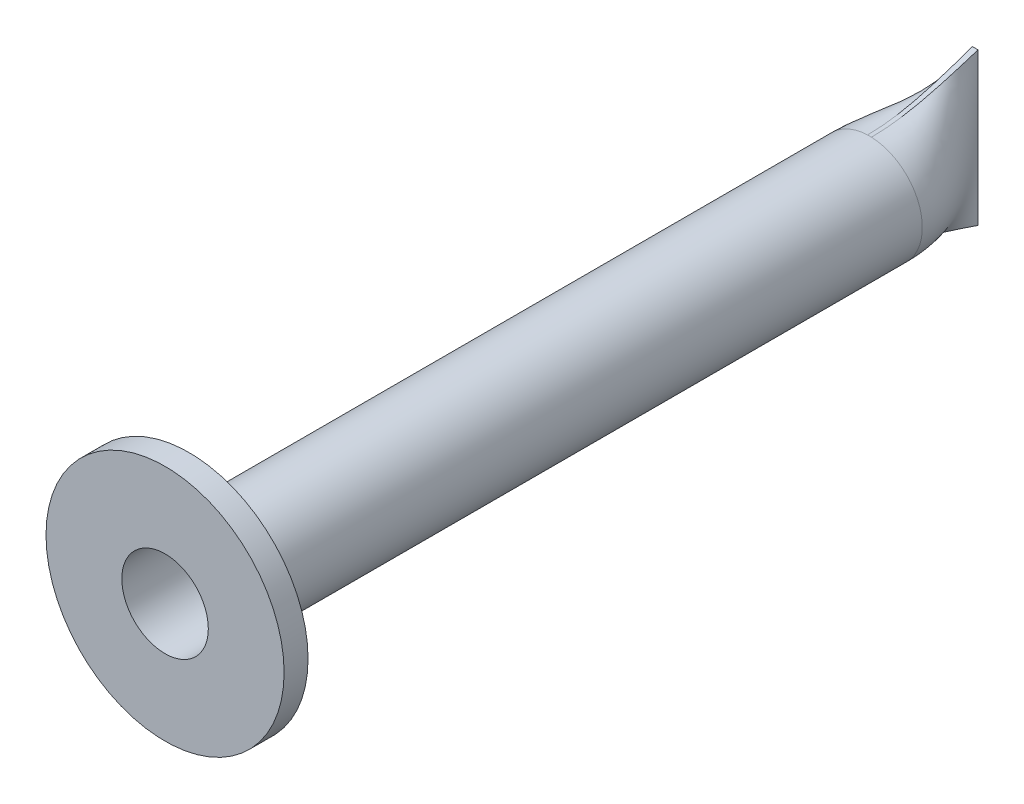
ISO-10303-21;
HEADER;
FILE_DESCRIPTION(('STEP AP214'),'2;1');
FILE_NAME('part.step','',(''),(''),'','','');
FILE_SCHEMA(('AUTOMOTIVE_DESIGN { 1 0 10303 214 1 1 1 1 }'));
ENDSEC;
DATA;
#1=APPLICATION_CONTEXT('core data for automotive mechanical design processes');
#2=APPLICATION_PROTOCOL_DEFINITION('international standard','automotive_design',2000,#1);
#3=PRODUCT_CONTEXT('',#1,'mechanical');
#4=PRODUCT('Part','Part','',(#3));
#5=PRODUCT_RELATED_PRODUCT_CATEGORY('part','',(#4));
#6=PRODUCT_DEFINITION_FORMATION('','',#4);
#7=PRODUCT_DEFINITION_CONTEXT('part definition',#1,'design');
#8=PRODUCT_DEFINITION('design','',#6,#7);
#9=PRODUCT_DEFINITION_SHAPE('','',#8);
#10=(LENGTH_UNIT() NAMED_UNIT(*) SI_UNIT(.MILLI.,.METRE.));
#11=(NAMED_UNIT(*) PLANE_ANGLE_UNIT() SI_UNIT($,.RADIAN.));
#12=(NAMED_UNIT(*) SI_UNIT($,.STERADIAN.) SOLID_ANGLE_UNIT());
#13=UNCERTAINTY_MEASURE_WITH_UNIT(LENGTH_MEASURE(1.E-05),#10,'distance_accuracy_value','');
#14=(GEOMETRIC_REPRESENTATION_CONTEXT(3) GLOBAL_UNCERTAINTY_ASSIGNED_CONTEXT((#13)) GLOBAL_UNIT_ASSIGNED_CONTEXT((#10,
#11,#12)) REPRESENTATION_CONTEXT('',''));
#15=CARTESIAN_POINT('',(0.,0.,0.));
#16=DIRECTION('',(0.,0.,1.));
#17=DIRECTION('',(1.,0.,0.));
#18=AXIS2_PLACEMENT_3D('',#15,#16,#17);
#19=CARTESIAN_POINT('',(0.,0.,-2.159));
#20=DIRECTION('',(0.,0.,-1.));
#21=DIRECTION('',(-1.,0.,0.));
#22=AXIS2_PLACEMENT_3D('',#19,#20,#21);
#23=PLANE('',#22);
#24=CARTESIAN_POINT('',(0.,0.,-2.159));
#25=DIRECTION('',(0.,0.,-1.));
#26=DIRECTION('',(-1.,0.,0.));
#27=AXIS2_PLACEMENT_3D('',#24,#25,#26);
#28=CIRCLE('',#27,4.7625);
#29=CARTESIAN_POINT('',(-4.7625,0.,-2.159));
#30=VERTEX_POINT('',#29);
#31=EDGE_CURVE('E13',#30,#30,#28,.T.);
#32=ORIENTED_EDGE('',*,*,#31,.F.);
#33=EDGE_LOOP('',(#32));
#34=FACE_BOUND('',#33,.T.);
#35=CARTESIAN_POINT('',(0.,0.,-2.159));
#36=DIRECTION('',(0.,0.,-1.));
#37=DIRECTION('',(-1.,0.,0.));
#38=AXIS2_PLACEMENT_3D('',#35,#36,#37);
#39=CIRCLE('',#38,10.7315);
#40=CARTESIAN_POINT('',(-10.7315,0.,-2.159));
#41=VERTEX_POINT('',#40);
#42=EDGE_CURVE('E114',#41,#41,#39,.T.);
#43=ORIENTED_EDGE('',*,*,#42,.T.);
#44=EDGE_LOOP('',(#43));
#45=FACE_BOUND('',#44,.T.);
#46=ADVANCED_FACE('F104',(#34,#45),#23,.T.);
#47=CARTESIAN_POINT('',(0.,0.,0.));
#48=DIRECTION('',(0.,0.,-1.));
#49=DIRECTION('',(-1.,0.,0.));
#50=AXIS2_PLACEMENT_3D('',#47,#48,#49);
#51=PLANE('',#50);
#52=CARTESIAN_POINT('',(0.,0.,0.));
#53=DIRECTION('',(0.,0.,-1.));
#54=DIRECTION('',(-1.,0.,0.));
#55=AXIS2_PLACEMENT_3D('',#52,#53,#54);
#56=CIRCLE('',#55,10.7315);
#57=CARTESIAN_POINT('',(-10.7315,0.,0.));
#58=VERTEX_POINT('',#57);
#59=EDGE_CURVE('E239',#58,#58,#56,.T.);
#60=ORIENTED_EDGE('',*,*,#59,.F.);
#61=EDGE_LOOP('',(#60));
#62=FACE_BOUND('',#61,.T.);
#63=CARTESIAN_POINT('',(0.,0.,0.));
#64=DIRECTION('',(0.,0.,1.));
#65=DIRECTION('',(1.,0.,0.));
#66=AXIS2_PLACEMENT_3D('',#63,#64,#65);
#67=CIRCLE('',#66,3.8989);
#68=CARTESIAN_POINT('',(3.8989,0.,0.));
#69=VERTEX_POINT('',#68);
#70=EDGE_CURVE('E234',#69,#69,#67,.T.);
#71=ORIENTED_EDGE('',*,*,#70,.F.);
#72=EDGE_LOOP('',(#71));
#73=FACE_BOUND('',#72,.T.);
#74=ADVANCED_FACE('F354',(#62,#73),#51,.F.);
#75=CARTESIAN_POINT('',(0.,0.,-2.159));
#76=DIRECTION('',(0.,0.,1.));
#77=DIRECTION('',(1.,0.,0.));
#78=AXIS2_PLACEMENT_3D('',#75,#76,#77);
#79=CYLINDRICAL_SURFACE('',#78,10.7315);
#80=ORIENTED_EDGE('',*,*,#42,.F.);
#81=EDGE_LOOP('',(#80));
#82=FACE_BOUND('',#81,.T.);
#83=ORIENTED_EDGE('',*,*,#59,.T.);
#84=EDGE_LOOP('',(#83));
#85=FACE_BOUND('',#84,.T.);
#86=ADVANCED_FACE('F106',(#82,#85),#79,.T.);
#87=CARTESIAN_POINT('',(0.,0.,-63.5));
#88=DIRECTION('',(0.,0.,1.));
#89=DIRECTION('',(1.,0.,0.));
#90=AXIS2_PLACEMENT_3D('',#87,#88,#89);
#91=CYLINDRICAL_SURFACE('',#90,3.8989);
#92=CARTESIAN_POINT('',(0.,0.,-63.5));
#93=DIRECTION('',(0.,0.,1.));
#94=DIRECTION('',(1.,0.,0.));
#95=AXIS2_PLACEMENT_3D('',#92,#93,#94);
#96=CIRCLE('',#95,3.8989);
#97=CARTESIAN_POINT('',(3.8989,0.,-63.5));
#98=VERTEX_POINT('',#97);
#99=EDGE_CURVE('E225',#98,#98,#96,.T.);
#100=ORIENTED_EDGE('',*,*,#99,.F.);
#101=EDGE_LOOP('',(#100));
#102=FACE_BOUND('',#101,.T.);
#103=ORIENTED_EDGE('',*,*,#70,.T.);
#104=EDGE_LOOP('',(#103));
#105=FACE_BOUND('',#104,.T.);
#106=ADVANCED_FACE('F363',(#102,#105),#91,.F.);
#107=CARTESIAN_POINT('',(0.,0.,-63.5));
#108=DIRECTION('',(0.,0.,1.));
#109=DIRECTION('',(1.,0.,0.));
#110=AXIS2_PLACEMENT_3D('',#107,#108,#109);
#111=CYLINDRICAL_SURFACE('',#110,4.7625);
#112=ORIENTED_EDGE('',*,*,#31,.T.);
#113=EDGE_LOOP('',(#112));
#114=FACE_BOUND('',#113,.T.);
#115=CARTESIAN_POINT('',(-0.17638888888889,4.75923241814019,-63.5));
#116=CARTESIAN_POINT('',(-0.117504537190115,4.76141481741313,-63.5));
#117=CARTESIAN_POINT('',(0.,4.76359721668607,-63.5));
#118=CARTESIAN_POINT('',(0.117504537190115,4.76141481741313,-63.5));
#119=CARTESIAN_POINT('',(0.176388888888889,4.75923241814019,-63.5));
#120=B_SPLINE_CURVE_WITH_KNOTS('',3,(#115,#116,#117,#118,#119),.UNSPECIFIED.,.F.,.F.,(4,1,4),
(0.,0.5,1.),.UNSPECIFIED.);
#121=CARTESIAN_POINT('',(0.176389443836606,4.75924754467353,-63.5));
#122=VERTEX_POINT('',#121);
#123=CARTESIAN_POINT('',(-0.176388888888891,4.75923241814019,-63.5));
#124=VERTEX_POINT('',#123);
#125=EDGE_CURVE('E233',#122,#124,#120,.F.);
#126=ORIENTED_EDGE('',*,*,#125,.T.);
#127=CARTESIAN_POINT('',(0.,0.,-63.5));
#128=DIRECTION('',(0.,0.,-1.));
#129=DIRECTION('',(-1.,0.,0.));
#130=AXIS2_PLACEMENT_3D('',#127,#128,#129);
#131=CIRCLE('',#130,4.7625);
#132=CARTESIAN_POINT('',(-0.176389443836615,-4.75924754467354,-63.5));
#133=VERTEX_POINT('',#132);
#134=EDGE_CURVE('E108',#133,#124,#131,.T.);
#135=ORIENTED_EDGE('',*,*,#134,.F.);
#136=CARTESIAN_POINT('',(0.17638888888889,-4.75923241814019,-63.5));
#137=VERTEX_POINT('',#136);
#138=EDGE_CURVE('E157',#137,#133,#131,.T.);
#139=ORIENTED_EDGE('',*,*,#138,.F.);
#140=EDGE_CURVE('E258',#122,#137,#131,.T.);
#141=ORIENTED_EDGE('',*,*,#140,.F.);
#142=EDGE_LOOP('',(#126,#135,#139,#141));
#143=FACE_BOUND('',#142,.T.);
#144=ADVANCED_FACE('F199',(#114,#143),#111,.T.);
#145=CARTESIAN_POINT('',(0.,0.,-63.5));
#146=DIRECTION('',(0.,0.,-1.));
#147=DIRECTION('',(-1.,0.,0.));
#148=AXIS2_PLACEMENT_3D('',#145,#146,#147);
#149=PLANE('',#148);
#150=ORIENTED_EDGE('',*,*,#99,.T.);
#151=EDGE_LOOP('',(#150));
#152=FACE_BOUND('',#151,.T.);
#153=ADVANCED_FACE('F193',(#152),#149,.F.);
#154=CARTESIAN_POINT('',(0.,0.,-73.025));
#155=DIRECTION('',(0.,0.,-1.));
#156=DIRECTION('',(-1.,0.,0.));
#157=AXIS2_PLACEMENT_3D('',#154,#155,#156);
#158=PLANE('',#157);
#159=CARTESIAN_POINT('',(0.,0.,-73.025));
#160=DIRECTION('',(0.,0.,-1.));
#161=DIRECTION('',(-1.,0.,0.));
#162=AXIS2_PLACEMENT_3D('',#159,#160,#161);
#163=CIRCLE('',#162,6.858);
#164=CARTESIAN_POINT('',(-0.254000000000001,6.85329468212188,-73.025));
#165=VERTEX_POINT('',#164);
#166=CARTESIAN_POINT('',(0.254,6.85329468212188,-73.025));
#167=VERTEX_POINT('',#166);
#168=EDGE_CURVE('E220',#165,#167,#163,.T.);
#169=ORIENTED_EDGE('',*,*,#168,.T.);
#170=DIRECTION('',(0.,-1.,0.));
#171=VECTOR('',#170,1.);
#172=CARTESIAN_POINT('',(0.254,-6.85329468212188,-73.025));
#173=LINE('',#172,#171);
#174=CARTESIAN_POINT('',(0.254,-6.85329468212188,-73.025));
#175=VERTEX_POINT('',#174);
#176=EDGE_CURVE('E174',#167,#175,#173,.T.);
#177=ORIENTED_EDGE('',*,*,#176,.T.);
#178=CARTESIAN_POINT('',(0.,0.,-73.025));
#179=DIRECTION('',(0.,0.,-1.));
#180=DIRECTION('',(-1.,0.,0.));
#181=AXIS2_PLACEMENT_3D('',#178,#179,#180);
#182=CIRCLE('',#181,6.858);
#183=CARTESIAN_POINT('',(-0.254000000000001,-6.85329468212188,-73.025));
#184=VERTEX_POINT('',#183);
#185=EDGE_CURVE('E153',#175,#184,#182,.T.);
#186=ORIENTED_EDGE('',*,*,#185,.T.);
#187=DIRECTION('',(0.,1.,0.));
#188=VECTOR('',#187,1.);
#189=CARTESIAN_POINT('',(-0.254000000000001,6.85329468212188,-73.025));
#190=LINE('',#189,#188);
#191=EDGE_CURVE('E161',#184,#165,#190,.T.);
#192=ORIENTED_EDGE('',*,*,#191,.T.);
#193=EDGE_LOOP('',(#169,#177,#186,#192));
#194=FACE_BOUND('',#193,.T.);
#195=ADVANCED_FACE('F173',(#194),#158,.T.);
#196=CARTESIAN_POINT('',(-0.176388888888888,-4.75923241814019,-63.5));
#197=CARTESIAN_POINT('',(-0.176388888888888,-4.75923241814019,-66.7205562821923));
#198=CARTESIAN_POINT('',(-0.215194444444445,-5.80626355013103,-69.8727781410962));
#199=CARTESIAN_POINT('',(-0.254000000000001,-6.85329468212187,-73.025));
#200=CARTESIAN_POINT('',(-2.73470600912153,-4.66441487728145,-63.5));
#201=CARTESIAN_POINT('',(-2.73470600912153,-4.66441487728145,-66.7990912044523));
#202=CARTESIAN_POINT('',(-1.49435300456077,-4.61663899934802,-69.9120456022261));
#203=CARTESIAN_POINT('',(-0.254000000000001,-4.56886312141458,-73.025));
#204=CARTESIAN_POINT('',(-4.7625,-2.56007360318604,-63.5));
#205=CARTESIAN_POINT('',(-4.7625,-2.56007360318604,-66.8776261267122));
#206=CARTESIAN_POINT('',(-2.50825,-2.42225258194666,-69.9513130633561));
#207=CARTESIAN_POINT('',(-0.254000000000001,-2.28443156070729,-73.025));
#208=CARTESIAN_POINT('',(-4.7625,2.56007360318604,-63.5));
#209=CARTESIAN_POINT('',(-4.7625,2.56007360318604,-66.8776261267122));
#210=CARTESIAN_POINT('',(-2.50825,2.42225258194666,-69.9513130633561));
#211=CARTESIAN_POINT('',(-0.254000000000001,2.28443156070729,-73.025));
#212=CARTESIAN_POINT('',(-2.73470600912153,4.66441487728145,-63.5));
#213=CARTESIAN_POINT('',(-2.73470600912153,4.66441487728145,-66.7990912044523));
#214=CARTESIAN_POINT('',(-1.49435300456077,4.61663899934802,-69.9120456022261));
#215=CARTESIAN_POINT('',(-0.254000000000001,4.56886312141459,-73.025));
#216=CARTESIAN_POINT('',(-0.176388888888891,4.75923241814019,-63.5));
#217=CARTESIAN_POINT('',(-0.176388888888891,4.75923241814019,-66.7205562821923));
#218=CARTESIAN_POINT('',(-0.215194444444446,5.80626355013103,-69.8727781410962));
#219=CARTESIAN_POINT('',(-0.254000000000001,6.85329468212188,-73.025));
#220=B_SPLINE_SURFACE_WITH_KNOTS('',3,3,((#196,#197,#198,#199),(#200,#201,#202,#203),(#204,#205,
#206,#207),(#208,#209,#210,#211),(#212,#213,#214,#215),(#216,#217,#218,#219)),.UNSPECIFIED.,.F.,
.F.,.F.,(4,2,4),(4,4),(0.,0.5,1.),(0.,1.),.UNSPECIFIED.);
#221=CARTESIAN_POINT('',(-0.176388888888891,4.75923241814019,-63.5));
#222=CARTESIAN_POINT('',(-0.176388888888891,4.75923241814019,-66.7205562821923));
#223=CARTESIAN_POINT('',(-0.215194444444446,5.80626355013103,-69.8727781410962));
#224=CARTESIAN_POINT('',(-0.254000000000001,6.85329468212188,-73.025));
#225=B_SPLINE_CURVE_WITH_KNOTS('',3,(#221,#222,#223,#224),.UNSPECIFIED.,.F.,.F.,(4,4),(0.,1.),.UNSPECIFIED.);
#226=EDGE_CURVE('E130',#124,#165,#225,.T.);
#227=CARTESIAN_POINT('',(-0.176388888888888,-4.75923241814019,-63.5));
#228=CARTESIAN_POINT('',(-0.176388888888888,-4.75923241814019,-66.7205562821923));
#229=CARTESIAN_POINT('',(-0.215194444444445,-5.80626355013103,-69.8727781410962));
#230=CARTESIAN_POINT('',(-0.254000000000001,-6.85329468212187,-73.025));
#231=B_SPLINE_CURVE_WITH_KNOTS('',3,(#227,#228,#229,#230),.UNSPECIFIED.,.F.,.F.,(4,4),(0.,1.),.UNSPECIFIED.);
#232=EDGE_CURVE('E148',#184,#133,#231,.F.);
#233=ORIENTED_EDGE('',*,*,#134,.T.);
#234=ORIENTED_EDGE('',*,*,#226,.T.);
#235=ORIENTED_EDGE('',*,*,#191,.F.);
#236=ORIENTED_EDGE('',*,*,#232,.T.);
#237=EDGE_LOOP('',(#233,#234,#235,#236));
#238=FACE_BOUND('',#237,.T.);
#239=ADVANCED_FACE('F163',(#238),#220,.T.);
#240=CARTESIAN_POINT('',(-0.17638888888889,4.75923241814019,-63.5));
#241=CARTESIAN_POINT('',(-0.17638888888889,4.75923241814019,-66.7205562821923));
#242=CARTESIAN_POINT('',(-0.215194444444445,5.80626355013103,-69.8727781410962));
#243=CARTESIAN_POINT('',(-0.254000000000001,6.85329468212188,-73.025));
#244=CARTESIAN_POINT('',(-0.117504537190115,4.76141481741313,-63.5));
#245=CARTESIAN_POINT('',(-0.117504537190115,4.76141481741313,-66.7205563390771));
#246=CARTESIAN_POINT('',(-0.143355535371941,5.80892607724402,-69.8727781695385));
#247=CARTESIAN_POINT('',(-0.169206533553766,6.85643733707491,-73.025));
#248=CARTESIAN_POINT('',(0.,4.76359721668607,-63.5));
#249=CARTESIAN_POINT('',(0.,4.76359721668607,-66.7205564528465));
#250=CARTESIAN_POINT('',(0.,5.811588604357,-69.8727782264233));
#251=CARTESIAN_POINT('',(0.,6.85957999202794,-73.025));
#252=CARTESIAN_POINT('',(0.117504537190115,4.76141481741313,-63.5));
#253=CARTESIAN_POINT('',(0.117504537190115,4.76141481741313,-66.7205563390771));
#254=CARTESIAN_POINT('',(0.14335553537194,5.80892607724402,-69.8727781695385));
#255=CARTESIAN_POINT('',(0.169206533553765,6.85643733707491,-73.025));
#256=CARTESIAN_POINT('',(0.176388888888889,4.75923241814019,-63.5));
#257=CARTESIAN_POINT('',(0.176388888888889,4.75923241814019,-66.7205562821923));
#258=CARTESIAN_POINT('',(0.215194444444445,5.80626355013103,-69.8727781410962));
#259=CARTESIAN_POINT('',(0.254,6.85329468212188,-73.025));
#260=B_SPLINE_SURFACE_WITH_KNOTS('',3,3,((#240,#241,#242,#243),(#244,#245,#246,#247),(#248,#249,
#250,#251),(#252,#253,#254,#255),(#256,#257,#258,#259)),.UNSPECIFIED.,.F.,.F.,.F.,(4,1,4),(4,4),
(0.,0.5,1.),(0.,1.),.UNSPECIFIED.);
#261=CARTESIAN_POINT('',(0.176388888888889,4.75923241814019,-63.5));
#262=CARTESIAN_POINT('',(0.176388888888889,4.75923241814019,-66.7205562821923));
#263=CARTESIAN_POINT('',(0.215194444444445,5.80626355013103,-69.8727781410962));
#264=CARTESIAN_POINT('',(0.254,6.85329468212188,-73.025));
#265=B_SPLINE_CURVE_WITH_KNOTS('',3,(#261,#262,#263,#264),.UNSPECIFIED.,.F.,.F.,(4,4),(0.,1.),.UNSPECIFIED.);
#266=EDGE_CURVE('E122',#122,#167,#265,.T.);
#267=ORIENTED_EDGE('',*,*,#125,.F.);
#268=ORIENTED_EDGE('',*,*,#266,.T.);
#269=ORIENTED_EDGE('',*,*,#168,.F.);
#270=ORIENTED_EDGE('',*,*,#226,.F.);
#271=EDGE_LOOP('',(#267,#268,#269,#270));
#272=FACE_BOUND('',#271,.T.);
#273=ADVANCED_FACE('F279',(#272),#260,.T.);
#274=CARTESIAN_POINT('',(0.17638888888889,-4.75923241814019,-63.5));
#275=CARTESIAN_POINT('',(0.17638888888889,-4.75923241814019,-66.7205562821923));
#276=CARTESIAN_POINT('',(0.215194444444446,-5.80626355013103,-69.8727781410962));
#277=CARTESIAN_POINT('',(0.254000000000002,-6.85329468212188,-73.025));
#278=CARTESIAN_POINT('',(0.117504537190116,-4.76141481741313,-63.5));
#279=CARTESIAN_POINT('',(0.117504537190116,-4.76141481741313,-66.7205563390771));
#280=CARTESIAN_POINT('',(0.143355535371942,-5.80892607724402,-69.8727781695385));
#281=CARTESIAN_POINT('',(0.169206533553767,-6.85643733707491,-73.025));
#282=CARTESIAN_POINT('',(0.,-4.76359721668607,-63.5));
#283=CARTESIAN_POINT('',(0.,-4.76359721668607,-66.7205564528465));
#284=CARTESIAN_POINT('',(0.,-5.811588604357,-69.8727782264233));
#285=CARTESIAN_POINT('',(0.,-6.85957999202794,-73.025));
#286=CARTESIAN_POINT('',(-0.117504537190114,-4.76141481741313,-63.5));
#287=CARTESIAN_POINT('',(-0.117504537190114,-4.76141481741313,-66.7205563390771));
#288=CARTESIAN_POINT('',(-0.143355535371939,-5.80892607724402,-69.8727781695385));
#289=CARTESIAN_POINT('',(-0.169206533553765,-6.85643733707491,-73.025));
#290=CARTESIAN_POINT('',(-0.176388888888888,-4.75923241814019,-63.5));
#291=CARTESIAN_POINT('',(-0.176388888888888,-4.75923241814019,-66.7205562821923));
#292=CARTESIAN_POINT('',(-0.215194444444444,-5.80626355013103,-69.8727781410962));
#293=CARTESIAN_POINT('',(-0.253999999999999,-6.85329468212188,-73.025));
#294=B_SPLINE_SURFACE_WITH_KNOTS('',3,3,((#274,#275,#276,#277),(#278,#279,#280,#281),(#282,#283,
#284,#285),(#286,#287,#288,#289),(#290,#291,#292,#293)),.UNSPECIFIED.,.F.,.F.,.F.,(4,1,4),(4,4),
(0.,0.5,1.),(0.,1.),.UNSPECIFIED.);
#295=CARTESIAN_POINT('',(0.17638888888889,-4.75923241814019,-63.5));
#296=CARTESIAN_POINT('',(0.17638888888889,-4.75923241814019,-66.7205562821923));
#297=CARTESIAN_POINT('',(0.215194444444445,-5.80626355013103,-69.8727781410962));
#298=CARTESIAN_POINT('',(0.254,-6.85329468212188,-73.025));
#299=B_SPLINE_CURVE_WITH_KNOTS('',3,(#295,#296,#297,#298),.UNSPECIFIED.,.F.,.F.,(4,4),(0.,1.),.UNSPECIFIED.);
#300=EDGE_CURVE('E167',#137,#175,#299,.T.);
#301=ORIENTED_EDGE('',*,*,#138,.T.);
#302=ORIENTED_EDGE('',*,*,#232,.F.);
#303=ORIENTED_EDGE('',*,*,#185,.F.);
#304=ORIENTED_EDGE('',*,*,#300,.F.);
#305=EDGE_LOOP('',(#301,#302,#303,#304));
#306=FACE_BOUND('',#305,.T.);
#307=ADVANCED_FACE('F150',(#306),#294,.T.);
#308=CARTESIAN_POINT('',(0.176388888888889,4.75923241814019,-63.5));
#309=CARTESIAN_POINT('',(0.176388888888889,4.75923241814019,-66.7205562821923));
#310=CARTESIAN_POINT('',(0.215194444444445,5.80626355013103,-69.8727781410962));
#311=CARTESIAN_POINT('',(0.254,6.85329468212187,-73.025));
#312=CARTESIAN_POINT('',(2.73470600912153,4.66441487728145,-63.5));
#313=CARTESIAN_POINT('',(2.73470600912153,4.66441487728145,-66.7990912044523));
#314=CARTESIAN_POINT('',(1.49435300456077,4.61663899934802,-69.9120456022261));
#315=CARTESIAN_POINT('',(0.254,4.56886312141458,-73.025));
#316=CARTESIAN_POINT('',(4.7625,2.56007360318604,-63.5));
#317=CARTESIAN_POINT('',(4.7625,2.56007360318604,-66.8776261267122));
#318=CARTESIAN_POINT('',(2.50825,2.42225258194666,-69.9513130633561));
#319=CARTESIAN_POINT('',(0.254,2.28443156070729,-73.025));
#320=CARTESIAN_POINT('',(4.7625,-2.56007360318604,-63.5));
#321=CARTESIAN_POINT('',(4.7625,-2.56007360318604,-66.8776261267122));
#322=CARTESIAN_POINT('',(2.50825,-2.42225258194666,-69.9513130633561));
#323=CARTESIAN_POINT('',(0.254,-2.28443156070729,-73.025));
#324=CARTESIAN_POINT('',(2.73470600912153,-4.66441487728145,-63.5));
#325=CARTESIAN_POINT('',(2.73470600912153,-4.66441487728145,-66.7990912044523));
#326=CARTESIAN_POINT('',(1.49435300456077,-4.61663899934802,-69.9120456022261));
#327=CARTESIAN_POINT('',(0.254,-4.56886312141459,-73.025));
#328=CARTESIAN_POINT('',(0.17638888888889,-4.75923241814019,-63.5));
#329=CARTESIAN_POINT('',(0.17638888888889,-4.75923241814019,-66.7205562821923));
#330=CARTESIAN_POINT('',(0.215194444444445,-5.80626355013103,-69.8727781410962));
#331=CARTESIAN_POINT('',(0.254,-6.85329468212188,-73.025));
#332=B_SPLINE_SURFACE_WITH_KNOTS('',3,3,((#308,#309,#310,#311),(#312,#313,#314,#315),(#316,#317,
#318,#319),(#320,#321,#322,#323),(#324,#325,#326,#327),(#328,#329,#330,#331)),.UNSPECIFIED.,.F.,
.F.,.F.,(4,2,4),(4,4),(0.,0.5,1.),(0.,1.),.UNSPECIFIED.);
#333=ORIENTED_EDGE('',*,*,#140,.T.);
#334=ORIENTED_EDGE('',*,*,#300,.T.);
#335=ORIENTED_EDGE('',*,*,#176,.F.);
#336=ORIENTED_EDGE('',*,*,#266,.F.);
#337=EDGE_LOOP('',(#333,#334,#335,#336));
#338=FACE_BOUND('',#337,.T.);
#339=ADVANCED_FACE('F194',(#338),#332,.T.);
#340=CLOSED_SHELL('',(#46,#74,#86,#106,#144,#153,#195,#239,#273,#307,#339));
#341=MANIFOLD_SOLID_BREP('B2',#340);
#342=ADVANCED_BREP_SHAPE_REPRESENTATION('',(#18,#341),#14);
#343=SHAPE_DEFINITION_REPRESENTATION(#9,#342);
ENDSEC;
END-ISO-10303-21;
